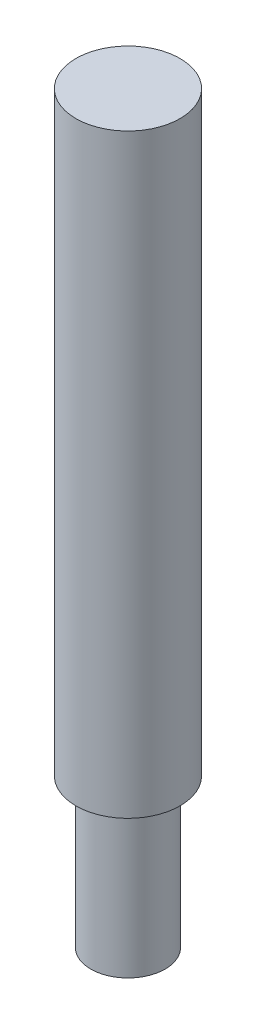
ISO-10303-21;
HEADER;
FILE_DESCRIPTION(('STEP AP214'),'2;1');
FILE_NAME('part.step','',(''),(''),'','','');
FILE_SCHEMA(('AUTOMOTIVE_DESIGN { 1 0 10303 214 1 1 1 1 }'));
ENDSEC;
DATA;
#1=APPLICATION_CONTEXT('core data for automotive mechanical design processes');
#2=APPLICATION_PROTOCOL_DEFINITION('international standard','automotive_design',2000,#1);
#3=PRODUCT_CONTEXT('',#1,'mechanical');
#4=PRODUCT('Part','Part','',(#3));
#5=PRODUCT_RELATED_PRODUCT_CATEGORY('part','',(#4));
#6=PRODUCT_DEFINITION_FORMATION('','',#4);
#7=PRODUCT_DEFINITION_CONTEXT('part definition',#1,'design');
#8=PRODUCT_DEFINITION('design','',#6,#7);
#9=PRODUCT_DEFINITION_SHAPE('','',#8);
#10=(LENGTH_UNIT() NAMED_UNIT(*) SI_UNIT(.MILLI.,.METRE.));
#11=(NAMED_UNIT(*) PLANE_ANGLE_UNIT() SI_UNIT($,.RADIAN.));
#12=(NAMED_UNIT(*) SI_UNIT($,.STERADIAN.) SOLID_ANGLE_UNIT());
#13=UNCERTAINTY_MEASURE_WITH_UNIT(LENGTH_MEASURE(1.E-05),#10,'distance_accuracy_value','');
#14=(GEOMETRIC_REPRESENTATION_CONTEXT(3) GLOBAL_UNCERTAINTY_ASSIGNED_CONTEXT((#13)) GLOBAL_UNIT_ASSIGNED_CONTEXT((#10,
#11,#12)) REPRESENTATION_CONTEXT('',''));
#15=CARTESIAN_POINT('',(0.,0.,0.));
#16=DIRECTION('',(0.,0.,1.));
#17=DIRECTION('',(1.,0.,0.));
#18=AXIS2_PLACEMENT_3D('',#15,#16,#17);
#19=CARTESIAN_POINT('',(0.,10.,0.));
#20=DIRECTION('',(0.,-1.,0.));
#21=DIRECTION('',(0.,0.,-1.));
#22=AXIS2_PLACEMENT_3D('',#19,#20,#21);
#23=CYLINDRICAL_SURFACE('',#22,2.5);
#24=CARTESIAN_POINT('',(0.,10.,0.));
#25=DIRECTION('',(0.,1.,0.));
#26=DIRECTION('',(0.,0.,1.));
#27=AXIS2_PLACEMENT_3D('',#24,#25,#26);
#28=CIRCLE('',#27,2.5);
#29=CARTESIAN_POINT('',(0.,10.,2.5));
#30=VERTEX_POINT('',#29);
#31=EDGE_CURVE('E10',#30,#30,#28,.T.);
#32=ORIENTED_EDGE('',*,*,#31,.F.);
#33=EDGE_LOOP('',(#32));
#34=FACE_BOUND('',#33,.T.);
#35=CARTESIAN_POINT('',(0.,0.,0.));
#36=DIRECTION('',(0.,1.,0.));
#37=DIRECTION('',(0.,0.,1.));
#38=AXIS2_PLACEMENT_3D('',#35,#36,#37);
#39=CIRCLE('',#38,2.5);
#40=CARTESIAN_POINT('',(0.,0.,2.5));
#41=VERTEX_POINT('',#40);
#42=EDGE_CURVE('E35',#41,#41,#39,.T.);
#43=ORIENTED_EDGE('',*,*,#42,.T.);
#44=EDGE_LOOP('',(#43));
#45=FACE_BOUND('',#44,.T.);
#46=ADVANCED_FACE('F32',(#34,#45),#23,.T.);
#47=CARTESIAN_POINT('',(0.,0.,0.));
#48=DIRECTION('',(0.,1.,0.));
#49=DIRECTION('',(0.,0.,1.));
#50=AXIS2_PLACEMENT_3D('',#47,#48,#49);
#51=PLANE('',#50);
#52=ORIENTED_EDGE('',*,*,#42,.F.);
#53=EDGE_LOOP('',(#52));
#54=FACE_BOUND('',#53,.T.);
#55=ADVANCED_FACE('F55',(#54),#51,.F.);
#56=CARTESIAN_POINT('',(0.,50.,0.));
#57=DIRECTION('',(0.,-1.,0.));
#58=DIRECTION('',(0.,0.,-1.));
#59=AXIS2_PLACEMENT_3D('',#56,#57,#58);
#60=CYLINDRICAL_SURFACE('',#59,3.5);
#61=CARTESIAN_POINT('',(0.,50.,0.));
#62=DIRECTION('',(0.,1.,0.));
#63=DIRECTION('',(0.,0.,1.));
#64=AXIS2_PLACEMENT_3D('',#61,#62,#63);
#65=CIRCLE('',#64,3.5);
#66=CARTESIAN_POINT('',(0.,50.,3.5));
#67=VERTEX_POINT('',#66);
#68=EDGE_CURVE('E42',#67,#67,#65,.T.);
#69=ORIENTED_EDGE('',*,*,#68,.F.);
#70=EDGE_LOOP('',(#69));
#71=FACE_BOUND('',#70,.T.);
#72=CARTESIAN_POINT('',(0.,10.,0.));
#73=DIRECTION('',(0.,1.,0.));
#74=DIRECTION('',(0.,0.,1.));
#75=AXIS2_PLACEMENT_3D('',#72,#73,#74);
#76=CIRCLE('',#75,3.5);
#77=CARTESIAN_POINT('',(0.,10.,3.5));
#78=VERTEX_POINT('',#77);
#79=EDGE_CURVE('E44',#78,#78,#76,.T.);
#80=ORIENTED_EDGE('',*,*,#79,.T.);
#81=EDGE_LOOP('',(#80));
#82=FACE_BOUND('',#81,.T.);
#83=ADVANCED_FACE('F52',(#71,#82),#60,.T.);
#84=CARTESIAN_POINT('',(0.,50.,0.));
#85=DIRECTION('',(0.,1.,0.));
#86=DIRECTION('',(0.,0.,1.));
#87=AXIS2_PLACEMENT_3D('',#84,#85,#86);
#88=PLANE('',#87);
#89=ORIENTED_EDGE('',*,*,#68,.T.);
#90=EDGE_LOOP('',(#89));
#91=FACE_BOUND('',#90,.T.);
#92=ADVANCED_FACE('F50',(#91),#88,.T.);
#93=CARTESIAN_POINT('',(0.,10.,0.));
#94=DIRECTION('',(0.,1.,0.));
#95=DIRECTION('',(0.,0.,1.));
#96=AXIS2_PLACEMENT_3D('',#93,#94,#95);
#97=PLANE('',#96);
#98=ORIENTED_EDGE('',*,*,#31,.T.);
#99=EDGE_LOOP('',(#98));
#100=FACE_BOUND('',#99,.T.);
#101=ORIENTED_EDGE('',*,*,#79,.F.);
#102=EDGE_LOOP('',(#101));
#103=FACE_BOUND('',#102,.T.);
#104=ADVANCED_FACE('F59',(#100,#103),#97,.F.);
#105=CLOSED_SHELL('',(#46,#55,#83,#92,#104));
#106=MANIFOLD_SOLID_BREP('B2',#105);
#107=ADVANCED_BREP_SHAPE_REPRESENTATION('',(#18,#106),#14);
#108=SHAPE_DEFINITION_REPRESENTATION(#9,#107);
ENDSEC;
END-ISO-10303-21;
